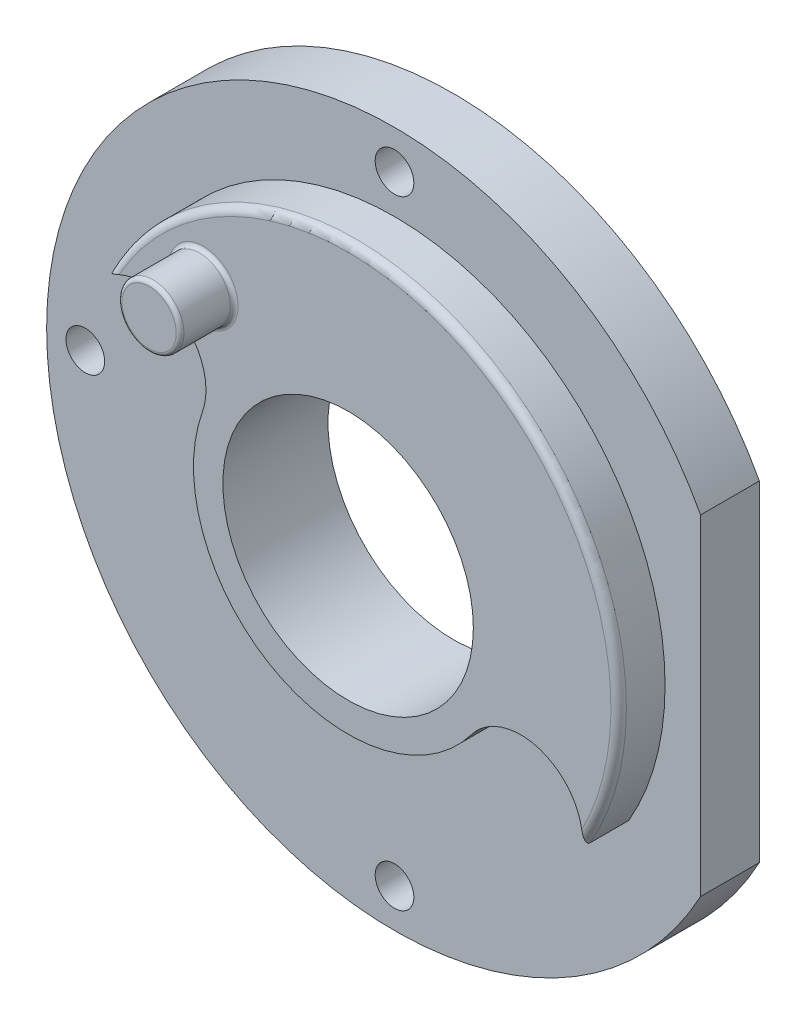
ISO-10303-21;
HEADER;
FILE_DESCRIPTION(('STEP AP214'),'2;1');
FILE_NAME('part.step','',(''),(''),'','','');
FILE_SCHEMA(('AUTOMOTIVE_DESIGN { 1 0 10303 214 1 1 1 1 }'));
ENDSEC;
DATA;
#1=APPLICATION_CONTEXT('core data for automotive mechanical design processes');
#2=APPLICATION_PROTOCOL_DEFINITION('international standard','automotive_design',2000,#1);
#3=PRODUCT_CONTEXT('',#1,'mechanical');
#4=PRODUCT('Part','Part','',(#3));
#5=PRODUCT_RELATED_PRODUCT_CATEGORY('part','',(#4));
#6=PRODUCT_DEFINITION_FORMATION('','',#4);
#7=PRODUCT_DEFINITION_CONTEXT('part definition',#1,'design');
#8=PRODUCT_DEFINITION('design','',#6,#7);
#9=PRODUCT_DEFINITION_SHAPE('','',#8);
#10=(LENGTH_UNIT() NAMED_UNIT(*) SI_UNIT(.MILLI.,.METRE.));
#11=(NAMED_UNIT(*) PLANE_ANGLE_UNIT() SI_UNIT($,.RADIAN.));
#12=(NAMED_UNIT(*) SI_UNIT($,.STERADIAN.) SOLID_ANGLE_UNIT());
#13=UNCERTAINTY_MEASURE_WITH_UNIT(LENGTH_MEASURE(1.E-05),#10,'distance_accuracy_value','');
#14=(GEOMETRIC_REPRESENTATION_CONTEXT(3) GLOBAL_UNCERTAINTY_ASSIGNED_CONTEXT((#13)) GLOBAL_UNIT_ASSIGNED_CONTEXT((#10,
#11,#12)) REPRESENTATION_CONTEXT('',''));
#15=CARTESIAN_POINT('',(0.,0.,0.));
#16=DIRECTION('',(0.,0.,1.));
#17=DIRECTION('',(1.,0.,0.));
#18=AXIS2_PLACEMENT_3D('',#15,#16,#17);
#19=CARTESIAN_POINT('',(0.,0.,3.8));
#20=DIRECTION('',(0.,0.,1.));
#21=DIRECTION('',(1.,0.,0.));
#22=AXIS2_PLACEMENT_3D('',#19,#20,#21);
#23=PLANE('',#22);
#24=DIRECTION('',(0.,-1.,0.));
#25=VECTOR('',#24,1.);
#26=CARTESIAN_POINT('',(19.8,-17.9414071691897,3.8));
#27=LINE('',#26,#25);
#28=CARTESIAN_POINT('',(19.8,10.6869078783341,3.8));
#29=VERTEX_POINT('',#28);
#30=CARTESIAN_POINT('',(19.8,-10.6869078783341,3.8));
#31=VERTEX_POINT('',#30);
#32=EDGE_CURVE('E61',#29,#31,#27,.T.);
#33=ORIENTED_EDGE('',*,*,#32,.F.);
#34=CARTESIAN_POINT('',(0.,0.,3.8));
#35=DIRECTION('',(0.,0.,1.));
#36=DIRECTION('',(1.,0.,0.));
#37=AXIS2_PLACEMENT_3D('',#34,#35,#36);
#38=CIRCLE('',#37,22.5);
#39=EDGE_CURVE('E112',#29,#31,#38,.T.);
#40=ORIENTED_EDGE('',*,*,#39,.T.);
#41=EDGE_LOOP('',(#33,#40));
#42=FACE_BOUND('',#41,.T.);
#43=CARTESIAN_POINT('',(0.,0.,3.8));
#44=DIRECTION('',(0.,0.,1.));
#45=DIRECTION('',(1.,0.,0.));
#46=AXIS2_PLACEMENT_3D('',#43,#44,#45);
#47=CIRCLE('',#46,17.5);
#48=CARTESIAN_POINT('',(15.1549923195811,-8.75078326742467,3.8));
#49=VERTEX_POINT('',#48);
#50=CARTESIAN_POINT('',(-15.6420504470762,7.84705408488593,3.8));
#51=VERTEX_POINT('',#50);
#52=EDGE_CURVE('E382',#49,#51,#47,.T.);
#53=ORIENTED_EDGE('',*,*,#52,.F.);
#54=CARTESIAN_POINT('',(11.1667639341912,-8.44413306610253,3.8));
#55=DIRECTION('',(0.,0.,1.));
#56=DIRECTION('',(1.,0.,0.));
#57=AXIS2_PLACEMENT_3D('',#54,#55,#56);
#58=CIRCLE('',#57,4.);
#59=CARTESIAN_POINT('',(7.97625995299374,-6.03152361864466,3.8));
#60=VERTEX_POINT('',#59);
#61=EDGE_CURVE('E416',#49,#60,#58,.T.);
#62=ORIENTED_EDGE('',*,*,#61,.T.);
#63=CARTESIAN_POINT('',(0.,0.,3.8));
#64=DIRECTION('',(0.,0.,-1.));
#65=DIRECTION('',(1.,0.,0.));
#66=AXIS2_PLACEMENT_3D('',#63,#64,#65);
#67=CIRCLE('',#66,10.);
#68=CARTESIAN_POINT('',(-9.42360161570558,3.34600247885013,3.8));
#69=VERTEX_POINT('',#68);
#70=EDGE_CURVE('E378',#60,#69,#67,.T.);
#71=ORIENTED_EDGE('',*,*,#70,.T.);
#72=CARTESIAN_POINT('',(-13.1930422619878,4.68440347039018,3.8));
#73=DIRECTION('',(0.,0.,1.));
#74=DIRECTION('',(1.,0.,0.));
#75=AXIS2_PLACEMENT_3D('',#72,#73,#74);
#76=CIRCLE('',#75,4.);
#77=EDGE_CURVE('E368',#69,#51,#76,.T.);
#78=ORIENTED_EDGE('',*,*,#77,.T.);
#79=EDGE_LOOP('',(#53,#62,#71,#78));
#80=FACE_BOUND('',#79,.T.);
#81=CARTESIAN_POINT('',(0.,-20.,3.8));
#82=DIRECTION('',(0.,0.,1.));
#83=DIRECTION('',(1.,0.,0.));
#84=AXIS2_PLACEMENT_3D('',#81,#82,#83);
#85=CIRCLE('',#84,1.25);
#86=CARTESIAN_POINT('',(-1.25,-20.,3.8));
#87=VERTEX_POINT('',#86);
#88=EDGE_CURVE('E392',#87,#87,#85,.T.);
#89=ORIENTED_EDGE('',*,*,#88,.F.);
#90=EDGE_LOOP('',(#89));
#91=FACE_BOUND('',#90,.T.);
#92=CARTESIAN_POINT('',(0.,20.,3.8));
#93=DIRECTION('',(0.,0.,1.));
#94=DIRECTION('',(1.,0.,0.));
#95=AXIS2_PLACEMENT_3D('',#92,#93,#94);
#96=CIRCLE('',#95,1.25);
#97=CARTESIAN_POINT('',(-1.25,20.,3.8));
#98=VERTEX_POINT('',#97);
#99=EDGE_CURVE('E121',#98,#98,#96,.T.);
#100=ORIENTED_EDGE('',*,*,#99,.F.);
#101=EDGE_LOOP('',(#100));
#102=FACE_BOUND('',#101,.T.);
#103=CARTESIAN_POINT('',(-20.,0.,3.8));
#104=DIRECTION('',(0.,0.,1.));
#105=DIRECTION('',(1.,0.,0.));
#106=AXIS2_PLACEMENT_3D('',#103,#104,#105);
#107=CIRCLE('',#106,1.25);
#108=CARTESIAN_POINT('',(-21.25,0.,3.8));
#109=VERTEX_POINT('',#108);
#110=EDGE_CURVE('E386',#109,#109,#107,.T.);
#111=ORIENTED_EDGE('',*,*,#110,.F.);
#112=EDGE_LOOP('',(#111));
#113=FACE_BOUND('',#112,.T.);
#114=ADVANCED_FACE('F46',(#42,#80,#91,#102,#113),#23,.T.);
#115=CARTESIAN_POINT('',(0.,0.,0.));
#116=DIRECTION('',(0.,0.,1.));
#117=DIRECTION('',(1.,0.,0.));
#118=AXIS2_PLACEMENT_3D('',#115,#116,#117);
#119=PLANE('',#118);
#120=CARTESIAN_POINT('',(0.,0.,0.));
#121=DIRECTION('',(0.,0.,1.));
#122=DIRECTION('',(1.,0.,0.));
#123=AXIS2_PLACEMENT_3D('',#120,#121,#122);
#124=CIRCLE('',#123,8.1);
#125=CARTESIAN_POINT('',(8.1,0.,0.));
#126=VERTEX_POINT('',#125);
#127=EDGE_CURVE('E370',#126,#126,#124,.T.);
#128=ORIENTED_EDGE('',*,*,#127,.T.);
#129=EDGE_LOOP('',(#128));
#130=FACE_BOUND('',#129,.T.);
#131=CARTESIAN_POINT('',(0.,0.,0.));
#132=DIRECTION('',(0.,0.,1.));
#133=DIRECTION('',(1.,0.,0.));
#134=AXIS2_PLACEMENT_3D('',#131,#132,#133);
#135=CIRCLE('',#134,22.5);
#136=CARTESIAN_POINT('',(19.8,10.6869078783341,0.));
#137=VERTEX_POINT('',#136);
#138=CARTESIAN_POINT('',(19.8,-10.6869078783341,0.));
#139=VERTEX_POINT('',#138);
#140=EDGE_CURVE('E116',#137,#139,#135,.T.);
#141=ORIENTED_EDGE('',*,*,#140,.F.);
#142=DIRECTION('',(0.,-1.,0.));
#143=VECTOR('',#142,1.);
#144=CARTESIAN_POINT('',(19.8,0.,0.));
#145=LINE('',#144,#143);
#146=EDGE_CURVE('E104',#137,#139,#145,.T.);
#147=ORIENTED_EDGE('',*,*,#146,.T.);
#148=EDGE_LOOP('',(#141,#147));
#149=FACE_BOUND('',#148,.T.);
#150=CARTESIAN_POINT('',(0.,20.,0.));
#151=DIRECTION('',(0.,0.,1.));
#152=DIRECTION('',(1.,0.,0.));
#153=AXIS2_PLACEMENT_3D('',#150,#151,#152);
#154=CIRCLE('',#153,1.25);
#155=CARTESIAN_POINT('',(-1.25,20.,0.));
#156=VERTEX_POINT('',#155);
#157=EDGE_CURVE('E124',#156,#156,#154,.T.);
#158=ORIENTED_EDGE('',*,*,#157,.T.);
#159=EDGE_LOOP('',(#158));
#160=FACE_BOUND('',#159,.T.);
#161=CARTESIAN_POINT('',(0.,-20.,0.));
#162=DIRECTION('',(0.,0.,1.));
#163=DIRECTION('',(1.,0.,0.));
#164=AXIS2_PLACEMENT_3D('',#161,#162,#163);
#165=CIRCLE('',#164,1.25);
#166=CARTESIAN_POINT('',(-1.25,-20.,0.));
#167=VERTEX_POINT('',#166);
#168=EDGE_CURVE('E389',#167,#167,#165,.T.);
#169=ORIENTED_EDGE('',*,*,#168,.T.);
#170=EDGE_LOOP('',(#169));
#171=FACE_BOUND('',#170,.T.);
#172=CARTESIAN_POINT('',(-20.,0.,0.));
#173=DIRECTION('',(0.,0.,1.));
#174=DIRECTION('',(1.,0.,0.));
#175=AXIS2_PLACEMENT_3D('',#172,#173,#174);
#176=CIRCLE('',#175,1.25);
#177=CARTESIAN_POINT('',(-21.25,0.,0.));
#178=VERTEX_POINT('',#177);
#179=EDGE_CURVE('E385',#178,#178,#176,.T.);
#180=ORIENTED_EDGE('',*,*,#179,.T.);
#181=EDGE_LOOP('',(#180));
#182=FACE_BOUND('',#181,.T.);
#183=ADVANCED_FACE('F199',(#130,#149,#160,#171,#182),#119,.F.);
#184=CARTESIAN_POINT('',(0.,0.,3.8));
#185=DIRECTION('',(0.,0.,-1.));
#186=DIRECTION('',(-1.,0.,0.));
#187=AXIS2_PLACEMENT_3D('',#184,#185,#186);
#188=CYLINDRICAL_SURFACE('',#187,22.5);
#189=ORIENTED_EDGE('',*,*,#39,.F.);
#190=DIRECTION('',(0.,0.,-1.));
#191=VECTOR('',#190,1.);
#192=CARTESIAN_POINT('',(19.8,10.6869078783341,3.8));
#193=LINE('',#192,#191);
#194=EDGE_CURVE('E11',#29,#137,#193,.T.);
#195=ORIENTED_EDGE('',*,*,#194,.T.);
#196=ORIENTED_EDGE('',*,*,#140,.T.);
#197=DIRECTION('',(0.,0.,-1.));
#198=VECTOR('',#197,1.);
#199=CARTESIAN_POINT('',(19.8,-10.6869078783341,3.8));
#200=LINE('',#199,#198);
#201=EDGE_CURVE('E54',#139,#31,#200,.F.);
#202=ORIENTED_EDGE('',*,*,#201,.T.);
#203=EDGE_LOOP('',(#189,#195,#196,#202));
#204=FACE_BOUND('',#203,.T.);
#205=ADVANCED_FACE('F114',(#204),#188,.T.);
#206=CARTESIAN_POINT('',(0.,20.,3.8));
#207=DIRECTION('',(0.,0.,-1.));
#208=DIRECTION('',(-1.,0.,0.));
#209=AXIS2_PLACEMENT_3D('',#206,#207,#208);
#210=CYLINDRICAL_SURFACE('',#209,1.25);
#211=CARTESIAN_POINT('',(-1.25,20.,3.8));
#212=CARTESIAN_POINT('',(-1.25,20.,3.76041666666667));
#213=CARTESIAN_POINT('',(-1.25,20.,3.72083333333333));
#214=CARTESIAN_POINT('',(-1.25,20.,3.64166666666667));
#215=CARTESIAN_POINT('',(-1.25,20.,3.60208333333333));
#216=CARTESIAN_POINT('',(-1.25,20.,3.52291666666667));
#217=CARTESIAN_POINT('',(-1.25,20.,3.48333333333333));
#218=CARTESIAN_POINT('',(-1.25,20.,3.40416666666667));
#219=CARTESIAN_POINT('',(-1.25,20.,3.36458333333333));
#220=CARTESIAN_POINT('',(-1.25,20.,3.28541666666667));
#221=CARTESIAN_POINT('',(-1.25,20.,3.24583333333333));
#222=CARTESIAN_POINT('',(-1.25,20.,3.16666666666667));
#223=CARTESIAN_POINT('',(-1.25,20.,3.12708333333333));
#224=CARTESIAN_POINT('',(-1.25,20.,3.04791666666667));
#225=CARTESIAN_POINT('',(-1.25,20.,3.00833333333333));
#226=CARTESIAN_POINT('',(-1.25,20.,2.92916666666667));
#227=CARTESIAN_POINT('',(-1.25,20.,2.88958333333333));
#228=CARTESIAN_POINT('',(-1.25,20.,2.81041666666667));
#229=CARTESIAN_POINT('',(-1.25,20.,2.77083333333333));
#230=CARTESIAN_POINT('',(-1.25,20.,2.69166666666667));
#231=CARTESIAN_POINT('',(-1.25,20.,2.65208333333333));
#232=CARTESIAN_POINT('',(-1.25,20.,2.57291666666667));
#233=CARTESIAN_POINT('',(-1.25,20.,2.53333333333333));
#234=CARTESIAN_POINT('',(-1.25,20.,2.45416666666667));
#235=CARTESIAN_POINT('',(-1.25,20.,2.41458333333333));
#236=CARTESIAN_POINT('',(-1.25,20.,2.33541666666667));
#237=CARTESIAN_POINT('',(-1.25,20.,2.29583333333333));
#238=CARTESIAN_POINT('',(-1.25,20.,2.21666666666667));
#239=CARTESIAN_POINT('',(-1.25,20.,2.17708333333333));
#240=CARTESIAN_POINT('',(-1.25,20.,2.09791666666667));
#241=CARTESIAN_POINT('',(-1.25,20.,2.05833333333333));
#242=CARTESIAN_POINT('',(-1.25,20.,1.97916666666667));
#243=CARTESIAN_POINT('',(-1.25,20.,1.93958333333333));
#244=CARTESIAN_POINT('',(-1.25,20.,1.86041666666667));
#245=CARTESIAN_POINT('',(-1.25,20.,1.82083333333333));
#246=CARTESIAN_POINT('',(-1.25,20.,1.74166666666667));
#247=CARTESIAN_POINT('',(-1.25,20.,1.70208333333333));
#248=CARTESIAN_POINT('',(-1.25,20.,1.62291666666667));
#249=CARTESIAN_POINT('',(-1.25,20.,1.58333333333333));
#250=CARTESIAN_POINT('',(-1.25,20.,1.50416666666667));
#251=CARTESIAN_POINT('',(-1.25,20.,1.46458333333333));
#252=CARTESIAN_POINT('',(-1.25,20.,1.38541666666667));
#253=CARTESIAN_POINT('',(-1.25,20.,1.34583333333333));
#254=CARTESIAN_POINT('',(-1.25,20.,1.26666666666667));
#255=CARTESIAN_POINT('',(-1.25,20.,1.22708333333333));
#256=CARTESIAN_POINT('',(-1.25,20.,1.14791666666667));
#257=CARTESIAN_POINT('',(-1.25,20.,1.10833333333333));
#258=CARTESIAN_POINT('',(-1.25,20.,1.02916666666667));
#259=CARTESIAN_POINT('',(-1.25,20.,0.989583333333334));
#260=CARTESIAN_POINT('',(-1.25,20.,0.910416666666667));
#261=CARTESIAN_POINT('',(-1.25,20.,0.870833333333333));
#262=CARTESIAN_POINT('',(-1.25,20.,0.791666666666667));
#263=CARTESIAN_POINT('',(-1.25,20.,0.752083333333333));
#264=CARTESIAN_POINT('',(-1.25,20.,0.672916666666667));
#265=CARTESIAN_POINT('',(-1.25,20.,0.633333333333333));
#266=CARTESIAN_POINT('',(-1.25,20.,0.554166666666667));
#267=CARTESIAN_POINT('',(-1.25,20.,0.514583333333334));
#268=CARTESIAN_POINT('',(-1.25,20.,0.435416666666667));
#269=CARTESIAN_POINT('',(-1.25,20.,0.395833333333334));
#270=CARTESIAN_POINT('',(-1.25,20.,0.316666666666667));
#271=CARTESIAN_POINT('',(-1.25,20.,0.277083333333333));
#272=CARTESIAN_POINT('',(-1.25,20.,0.197916666666667));
#273=CARTESIAN_POINT('',(-1.25,20.,0.158333333333333));
#274=CARTESIAN_POINT('',(-1.25,20.,0.0791666666666666));
#275=CARTESIAN_POINT('',(-1.25,20.,0.0395833333333333));
#276=CARTESIAN_POINT('',(-1.25,20.,0.));
#277=B_SPLINE_CURVE_WITH_KNOTS('',3,(#211,#212,#213,#214,#215,#216,#217,#218,#219,#220,#221,
#222,#223,#224,#225,#226,#227,#228,#229,#230,#231,#232,#233,#234,#235,#236,#237,#238,#239,#240,
#241,#242,#243,#244,#245,#246,#247,#248,#249,#250,#251,#252,#253,#254,#255,#256,#257,#258,#259,
#260,#261,#262,#263,#264,#265,#266,#267,#268,#269,#270,#271,#272,#273,#274,#275,#276),
.UNSPECIFIED.,.F.,.F.,(4,2,2,2,2,2,2,2,2,2,2,2,2,2,2,2,2,2,2,2,2,2,2,2,2,2,2,2,2,2,2,2,4),(0.,
0.11875,0.2375,0.35625,0.475,0.59375,0.7125,0.83125,0.95,1.06875,1.1875,1.30625,1.425,1.54375,
1.6625,1.78125,1.9,2.01875,2.1375,2.25625,2.375,2.49375,2.6125,2.73125,2.85,2.96875,3.0875,
3.20625,3.325,3.44375,3.5625,3.68125,3.8),.UNSPECIFIED.);
#278=EDGE_CURVE('BSEAM192',#98,#156,#277,.T.);
#279=ORIENTED_EDGE('',*,*,#99,.T.);
#280=ORIENTED_EDGE('',*,*,#157,.F.);
#281=ORIENTED_EDGE('',*,*,#278,.T.);
#282=ORIENTED_EDGE('',*,*,#278,.F.);
#283=EDGE_LOOP('',(#279,#281,#280,#282));
#284=FACE_BOUND('',#283,.T.);
#285=ADVANCED_FACE('F192',(#284),#210,.F.);
#286=CARTESIAN_POINT('',(0.,-20.,3.8));
#287=DIRECTION('',(0.,0.,-1.));
#288=DIRECTION('',(-1.,0.,0.));
#289=AXIS2_PLACEMENT_3D('',#286,#287,#288);
#290=CYLINDRICAL_SURFACE('',#289,1.25);
#291=CARTESIAN_POINT('',(-1.25,-20.,3.8));
#292=CARTESIAN_POINT('',(-1.25,-20.,3.76041666666667));
#293=CARTESIAN_POINT('',(-1.25,-20.,3.72083333333333));
#294=CARTESIAN_POINT('',(-1.25,-20.,3.64166666666667));
#295=CARTESIAN_POINT('',(-1.25,-20.,3.60208333333333));
#296=CARTESIAN_POINT('',(-1.25,-20.,3.52291666666667));
#297=CARTESIAN_POINT('',(-1.25,-20.,3.48333333333333));
#298=CARTESIAN_POINT('',(-1.25,-20.,3.40416666666667));
#299=CARTESIAN_POINT('',(-1.25,-20.,3.36458333333333));
#300=CARTESIAN_POINT('',(-1.25,-20.,3.28541666666667));
#301=CARTESIAN_POINT('',(-1.25,-20.,3.24583333333333));
#302=CARTESIAN_POINT('',(-1.25,-20.,3.16666666666667));
#303=CARTESIAN_POINT('',(-1.25,-20.,3.12708333333333));
#304=CARTESIAN_POINT('',(-1.25,-20.,3.04791666666667));
#305=CARTESIAN_POINT('',(-1.25,-20.,3.00833333333333));
#306=CARTESIAN_POINT('',(-1.25,-20.,2.92916666666667));
#307=CARTESIAN_POINT('',(-1.25,-20.,2.88958333333333));
#308=CARTESIAN_POINT('',(-1.25,-20.,2.81041666666667));
#309=CARTESIAN_POINT('',(-1.25,-20.,2.77083333333333));
#310=CARTESIAN_POINT('',(-1.25,-20.,2.69166666666667));
#311=CARTESIAN_POINT('',(-1.25,-20.,2.65208333333333));
#312=CARTESIAN_POINT('',(-1.25,-20.,2.57291666666667));
#313=CARTESIAN_POINT('',(-1.25,-20.,2.53333333333333));
#314=CARTESIAN_POINT('',(-1.25,-20.,2.45416666666667));
#315=CARTESIAN_POINT('',(-1.25,-20.,2.41458333333333));
#316=CARTESIAN_POINT('',(-1.25,-20.,2.33541666666667));
#317=CARTESIAN_POINT('',(-1.25,-20.,2.29583333333333));
#318=CARTESIAN_POINT('',(-1.25,-20.,2.21666666666667));
#319=CARTESIAN_POINT('',(-1.25,-20.,2.17708333333333));
#320=CARTESIAN_POINT('',(-1.25,-20.,2.09791666666667));
#321=CARTESIAN_POINT('',(-1.25,-20.,2.05833333333333));
#322=CARTESIAN_POINT('',(-1.25,-20.,1.97916666666667));
#323=CARTESIAN_POINT('',(-1.25,-20.,1.93958333333333));
#324=CARTESIAN_POINT('',(-1.25,-20.,1.86041666666667));
#325=CARTESIAN_POINT('',(-1.25,-20.,1.82083333333333));
#326=CARTESIAN_POINT('',(-1.25,-20.,1.74166666666667));
#327=CARTESIAN_POINT('',(-1.25,-20.,1.70208333333333));
#328=CARTESIAN_POINT('',(-1.25,-20.,1.62291666666667));
#329=CARTESIAN_POINT('',(-1.25,-20.,1.58333333333333));
#330=CARTESIAN_POINT('',(-1.25,-20.,1.50416666666667));
#331=CARTESIAN_POINT('',(-1.25,-20.,1.46458333333333));
#332=CARTESIAN_POINT('',(-1.25,-20.,1.38541666666667));
#333=CARTESIAN_POINT('',(-1.25,-20.,1.34583333333333));
#334=CARTESIAN_POINT('',(-1.25,-20.,1.26666666666667));
#335=CARTESIAN_POINT('',(-1.25,-20.,1.22708333333333));
#336=CARTESIAN_POINT('',(-1.25,-20.,1.14791666666667));
#337=CARTESIAN_POINT('',(-1.25,-20.,1.10833333333333));
#338=CARTESIAN_POINT('',(-1.25,-20.,1.02916666666667));
#339=CARTESIAN_POINT('',(-1.25,-20.,0.989583333333334));
#340=CARTESIAN_POINT('',(-1.25,-20.,0.910416666666667));
#341=CARTESIAN_POINT('',(-1.25,-20.,0.870833333333333));
#342=CARTESIAN_POINT('',(-1.25,-20.,0.791666666666667));
#343=CARTESIAN_POINT('',(-1.25,-20.,0.752083333333333));
#344=CARTESIAN_POINT('',(-1.25,-20.,0.672916666666667));
#345=CARTESIAN_POINT('',(-1.25,-20.,0.633333333333333));
#346=CARTESIAN_POINT('',(-1.25,-20.,0.554166666666667));
#347=CARTESIAN_POINT('',(-1.25,-20.,0.514583333333334));
#348=CARTESIAN_POINT('',(-1.25,-20.,0.435416666666667));
#349=CARTESIAN_POINT('',(-1.25,-20.,0.395833333333334));
#350=CARTESIAN_POINT('',(-1.25,-20.,0.316666666666667));
#351=CARTESIAN_POINT('',(-1.25,-20.,0.277083333333333));
#352=CARTESIAN_POINT('',(-1.25,-20.,0.197916666666667));
#353=CARTESIAN_POINT('',(-1.25,-20.,0.158333333333333));
#354=CARTESIAN_POINT('',(-1.25,-20.,0.0791666666666666));
#355=CARTESIAN_POINT('',(-1.25,-20.,0.0395833333333333));
#356=CARTESIAN_POINT('',(-1.25,-20.,0.));
#357=B_SPLINE_CURVE_WITH_KNOTS('',3,(#291,#292,#293,#294,#295,#296,#297,#298,#299,#300,#301,
#302,#303,#304,#305,#306,#307,#308,#309,#310,#311,#312,#313,#314,#315,#316,#317,#318,#319,#320,
#321,#322,#323,#324,#325,#326,#327,#328,#329,#330,#331,#332,#333,#334,#335,#336,#337,#338,#339,
#340,#341,#342,#343,#344,#345,#346,#347,#348,#349,#350,#351,#352,#353,#354,#355,#356),
.UNSPECIFIED.,.F.,.F.,(4,2,2,2,2,2,2,2,2,2,2,2,2,2,2,2,2,2,2,2,2,2,2,2,2,2,2,2,2,2,2,2,4),(0.,
0.11875,0.2375,0.35625,0.475,0.59375,0.7125,0.83125,0.95,1.06875,1.1875,1.30625,1.425,1.54375,
1.6625,1.78125,1.9,2.01875,2.1375,2.25625,2.375,2.49375,2.6125,2.73125,2.85,2.96875,3.0875,
3.20625,3.325,3.44375,3.5625,3.68125,3.8),.UNSPECIFIED.);
#358=EDGE_CURVE('BSEAM188',#87,#167,#357,.T.);
#359=ORIENTED_EDGE('',*,*,#88,.T.);
#360=ORIENTED_EDGE('',*,*,#168,.F.);
#361=ORIENTED_EDGE('',*,*,#358,.T.);
#362=ORIENTED_EDGE('',*,*,#358,.F.);
#363=EDGE_LOOP('',(#359,#361,#360,#362));
#364=FACE_BOUND('',#363,.T.);
#365=ADVANCED_FACE('F188',(#364),#290,.F.);
#366=CARTESIAN_POINT('',(-20.,0.,3.8));
#367=DIRECTION('',(0.,0.,-1.));
#368=DIRECTION('',(-1.,0.,0.));
#369=AXIS2_PLACEMENT_3D('',#366,#367,#368);
#370=CYLINDRICAL_SURFACE('',#369,1.25);
#371=CARTESIAN_POINT('',(-21.25,0.,3.8));
#372=CARTESIAN_POINT('',(-21.25,0.,3.76041666666667));
#373=CARTESIAN_POINT('',(-21.25,0.,3.72083333333333));
#374=CARTESIAN_POINT('',(-21.25,0.,3.64166666666667));
#375=CARTESIAN_POINT('',(-21.25,0.,3.60208333333333));
#376=CARTESIAN_POINT('',(-21.25,0.,3.52291666666667));
#377=CARTESIAN_POINT('',(-21.25,0.,3.48333333333333));
#378=CARTESIAN_POINT('',(-21.25,0.,3.40416666666667));
#379=CARTESIAN_POINT('',(-21.25,0.,3.36458333333333));
#380=CARTESIAN_POINT('',(-21.25,0.,3.28541666666667));
#381=CARTESIAN_POINT('',(-21.25,0.,3.24583333333333));
#382=CARTESIAN_POINT('',(-21.25,0.,3.16666666666667));
#383=CARTESIAN_POINT('',(-21.25,0.,3.12708333333333));
#384=CARTESIAN_POINT('',(-21.25,0.,3.04791666666667));
#385=CARTESIAN_POINT('',(-21.25,0.,3.00833333333333));
#386=CARTESIAN_POINT('',(-21.25,0.,2.92916666666667));
#387=CARTESIAN_POINT('',(-21.25,0.,2.88958333333333));
#388=CARTESIAN_POINT('',(-21.25,0.,2.81041666666667));
#389=CARTESIAN_POINT('',(-21.25,0.,2.77083333333333));
#390=CARTESIAN_POINT('',(-21.25,0.,2.69166666666667));
#391=CARTESIAN_POINT('',(-21.25,0.,2.65208333333333));
#392=CARTESIAN_POINT('',(-21.25,0.,2.57291666666667));
#393=CARTESIAN_POINT('',(-21.25,0.,2.53333333333333));
#394=CARTESIAN_POINT('',(-21.25,0.,2.45416666666667));
#395=CARTESIAN_POINT('',(-21.25,0.,2.41458333333333));
#396=CARTESIAN_POINT('',(-21.25,0.,2.33541666666667));
#397=CARTESIAN_POINT('',(-21.25,0.,2.29583333333333));
#398=CARTESIAN_POINT('',(-21.25,0.,2.21666666666667));
#399=CARTESIAN_POINT('',(-21.25,0.,2.17708333333333));
#400=CARTESIAN_POINT('',(-21.25,0.,2.09791666666667));
#401=CARTESIAN_POINT('',(-21.25,0.,2.05833333333333));
#402=CARTESIAN_POINT('',(-21.25,0.,1.97916666666667));
#403=CARTESIAN_POINT('',(-21.25,0.,1.93958333333333));
#404=CARTESIAN_POINT('',(-21.25,0.,1.86041666666667));
#405=CARTESIAN_POINT('',(-21.25,0.,1.82083333333333));
#406=CARTESIAN_POINT('',(-21.25,0.,1.74166666666667));
#407=CARTESIAN_POINT('',(-21.25,0.,1.70208333333333));
#408=CARTESIAN_POINT('',(-21.25,0.,1.62291666666667));
#409=CARTESIAN_POINT('',(-21.25,0.,1.58333333333333));
#410=CARTESIAN_POINT('',(-21.25,0.,1.50416666666667));
#411=CARTESIAN_POINT('',(-21.25,0.,1.46458333333333));
#412=CARTESIAN_POINT('',(-21.25,0.,1.38541666666667));
#413=CARTESIAN_POINT('',(-21.25,0.,1.34583333333333));
#414=CARTESIAN_POINT('',(-21.25,0.,1.26666666666667));
#415=CARTESIAN_POINT('',(-21.25,0.,1.22708333333333));
#416=CARTESIAN_POINT('',(-21.25,0.,1.14791666666667));
#417=CARTESIAN_POINT('',(-21.25,0.,1.10833333333333));
#418=CARTESIAN_POINT('',(-21.25,0.,1.02916666666667));
#419=CARTESIAN_POINT('',(-21.25,0.,0.989583333333334));
#420=CARTESIAN_POINT('',(-21.25,0.,0.910416666666667));
#421=CARTESIAN_POINT('',(-21.25,0.,0.870833333333333));
#422=CARTESIAN_POINT('',(-21.25,0.,0.791666666666667));
#423=CARTESIAN_POINT('',(-21.25,0.,0.752083333333333));
#424=CARTESIAN_POINT('',(-21.25,0.,0.672916666666667));
#425=CARTESIAN_POINT('',(-21.25,0.,0.633333333333333));
#426=CARTESIAN_POINT('',(-21.25,0.,0.554166666666667));
#427=CARTESIAN_POINT('',(-21.25,0.,0.514583333333334));
#428=CARTESIAN_POINT('',(-21.25,0.,0.435416666666667));
#429=CARTESIAN_POINT('',(-21.25,0.,0.395833333333334));
#430=CARTESIAN_POINT('',(-21.25,0.,0.316666666666667));
#431=CARTESIAN_POINT('',(-21.25,0.,0.277083333333333));
#432=CARTESIAN_POINT('',(-21.25,0.,0.197916666666667));
#433=CARTESIAN_POINT('',(-21.25,0.,0.158333333333333));
#434=CARTESIAN_POINT('',(-21.25,0.,0.0791666666666666));
#435=CARTESIAN_POINT('',(-21.25,0.,0.0395833333333333));
#436=CARTESIAN_POINT('',(-21.25,0.,0.));
#437=B_SPLINE_CURVE_WITH_KNOTS('',3,(#371,#372,#373,#374,#375,#376,#377,#378,#379,#380,#381,
#382,#383,#384,#385,#386,#387,#388,#389,#390,#391,#392,#393,#394,#395,#396,#397,#398,#399,#400,
#401,#402,#403,#404,#405,#406,#407,#408,#409,#410,#411,#412,#413,#414,#415,#416,#417,#418,#419,
#420,#421,#422,#423,#424,#425,#426,#427,#428,#429,#430,#431,#432,#433,#434,#435,#436),
.UNSPECIFIED.,.F.,.F.,(4,2,2,2,2,2,2,2,2,2,2,2,2,2,2,2,2,2,2,2,2,2,2,2,2,2,2,2,2,2,2,2,4),(0.,
0.11875,0.2375,0.35625,0.475,0.59375,0.7125,0.83125,0.95,1.06875,1.1875,1.30625,1.425,1.54375,
1.6625,1.78125,1.9,2.01875,2.1375,2.25625,2.375,2.49375,2.6125,2.73125,2.85,2.96875,3.0875,
3.20625,3.325,3.44375,3.5625,3.68125,3.8),.UNSPECIFIED.);
#438=EDGE_CURVE('BSEAM184',#109,#178,#437,.T.);
#439=ORIENTED_EDGE('',*,*,#110,.T.);
#440=ORIENTED_EDGE('',*,*,#179,.F.);
#441=ORIENTED_EDGE('',*,*,#438,.T.);
#442=ORIENTED_EDGE('',*,*,#438,.F.);
#443=EDGE_LOOP('',(#439,#441,#440,#442));
#444=FACE_BOUND('',#443,.T.);
#445=ADVANCED_FACE('F184',(#444),#370,.F.);
#446=CARTESIAN_POINT('',(0.,0.,6.8));
#447=DIRECTION('',(0.,0.,-1.));
#448=DIRECTION('',(-1.,0.,0.));
#449=AXIS2_PLACEMENT_3D('',#446,#447,#448);
#450=CYLINDRICAL_SURFACE('',#449,17.5);
#451=ORIENTED_EDGE('',*,*,#52,.T.);
#452=DIRECTION('',(0.,0.,1.));
#453=VECTOR('',#452,1.);
#454=CARTESIAN_POINT('',(-15.6420504470762,7.84705408488592,5.3));
#455=LINE('',#454,#453);
#456=CARTESIAN_POINT('',(-15.6420504470762,7.84705408488594,6.30000000000087));
#457=VERTEX_POINT('',#456);
#458=EDGE_CURVE('E380',#51,#457,#455,.T.);
#459=ORIENTED_EDGE('',*,*,#458,.T.);
#460=CARTESIAN_POINT('',(0.,0.,6.3));
#461=DIRECTION('',(0.,0.,1.));
#462=DIRECTION('',(1.,0.,0.));
#463=AXIS2_PLACEMENT_3D('',#460,#461,#462);
#464=CIRCLE('',#463,17.5);
#465=CARTESIAN_POINT('',(15.1549923195811,-8.75078326742466,6.3));
#466=VERTEX_POINT('',#465);
#467=EDGE_CURVE('E119',#457,#466,#464,.F.);
#468=ORIENTED_EDGE('',*,*,#467,.T.);
#469=DIRECTION('',(0.,0.,1.));
#470=VECTOR('',#469,1.);
#471=CARTESIAN_POINT('',(15.1549923195811,-8.75078326742468,5.3));
#472=LINE('',#471,#470);
#473=EDGE_CURVE('E69',#466,#49,#472,.F.);
#474=ORIENTED_EDGE('',*,*,#473,.T.);
#475=EDGE_LOOP('',(#451,#459,#468,#474));
#476=FACE_BOUND('',#475,.T.);
#477=ADVANCED_FACE('F180',(#476),#450,.T.);
#478=CARTESIAN_POINT('',(0.,0.,6.8));
#479=DIRECTION('',(0.,0.,1.));
#480=DIRECTION('',(1.,0.,0.));
#481=AXIS2_PLACEMENT_3D('',#478,#479,#480);
#482=PLANE('',#481);
#483=CARTESIAN_POINT('',(0.,0.,6.8));
#484=DIRECTION('',(0.,0.,1.));
#485=DIRECTION('',(1.,0.,0.));
#486=AXIS2_PLACEMENT_3D('',#483,#484,#485);
#487=CIRCLE('',#486,8.1);
#488=CARTESIAN_POINT('',(8.1,0.,6.8));
#489=VERTEX_POINT('',#488);
#490=EDGE_CURVE('E424',#489,#489,#487,.T.);
#491=ORIENTED_EDGE('',*,*,#490,.F.);
#492=EDGE_LOOP('',(#491));
#493=FACE_BOUND('',#492,.T.);
#494=CARTESIAN_POINT('',(-13.1930422619878,4.68440347039018,6.8));
#495=DIRECTION('',(0.,0.,1.));
#496=DIRECTION('',(1.,0.,0.));
#497=AXIS2_PLACEMENT_3D('',#494,#495,#496);
#498=CIRCLE('',#497,4.);
#499=CARTESIAN_POINT('',(-9.42360161570558,3.34600247885013,6.8));
#500=VERTEX_POINT('',#499);
#501=CARTESIAN_POINT('',(-14.8126068155352,8.34186306099305,6.8));
#502=VERTEX_POINT('',#501);
#503=EDGE_CURVE('E361',#500,#502,#498,.T.);
#504=ORIENTED_EDGE('',*,*,#503,.F.);
#505=CARTESIAN_POINT('',(0.,0.,6.8));
#506=DIRECTION('',(0.,0.,-1.));
#507=DIRECTION('',(1.,0.,0.));
#508=AXIS2_PLACEMENT_3D('',#505,#506,#507);
#509=CIRCLE('',#508,10.);
#510=CARTESIAN_POINT('',(7.97625995299374,-6.03152361864466,6.8));
#511=VERTEX_POINT('',#510);
#512=EDGE_CURVE('E364',#511,#500,#509,.T.);
#513=ORIENTED_EDGE('',*,*,#512,.F.);
#514=CARTESIAN_POINT('',(11.1667639341912,-8.44413306610253,6.8));
#515=DIRECTION('',(0.,0.,1.));
#516=DIRECTION('',(1.,0.,0.));
#517=AXIS2_PLACEMENT_3D('',#514,#515,#516);
#518=CIRCLE('',#517,4.);
#519=CARTESIAN_POINT('',(15.1122347108096,-7.78590791400737,6.8));
#520=VERTEX_POINT('',#519);
#521=EDGE_CURVE('E362',#520,#511,#518,.T.);
#522=ORIENTED_EDGE('',*,*,#521,.F.);
#523=CARTESIAN_POINT('',(0.,0.,6.8));
#524=DIRECTION('',(0.,0.,1.));
#525=DIRECTION('',(1.,0.,0.));
#526=AXIS2_PLACEMENT_3D('',#523,#524,#525);
#527=CIRCLE('',#526,17.);
#528=EDGE_CURVE('E115',#520,#502,#527,.T.);
#529=ORIENTED_EDGE('',*,*,#528,.T.);
#530=EDGE_LOOP('',(#504,#513,#522,#529));
#531=FACE_BOUND('',#530,.T.);
#532=CARTESIAN_POINT('',(-9.367828489024,10.4040275566835,6.8));
#533=DIRECTION('',(0.,0.,1.));
#534=DIRECTION('',(1.,0.,0.));
#535=AXIS2_PLACEMENT_3D('',#532,#533,#534);
#536=CIRCLE('',#535,2.25);
#537=CARTESIAN_POINT('',(-7.117828489024,10.4040275566835,6.8));
#538=VERTEX_POINT('',#537);
#539=EDGE_CURVE('E135',#538,#538,#536,.F.);
#540=ORIENTED_EDGE('',*,*,#539,.T.);
#541=EDGE_LOOP('',(#540));
#542=FACE_BOUND('',#541,.T.);
#543=ADVANCED_FACE('F176',(#493,#531,#542),#482,.T.);
#544=CARTESIAN_POINT('',(-9.367828489024,10.4040275566835,10.3));
#545=DIRECTION('',(0.,0.,-1.));
#546=DIRECTION('',(-1.,0.,0.));
#547=AXIS2_PLACEMENT_3D('',#544,#545,#546);
#548=CYLINDRICAL_SURFACE('',#547,2.);
#549=CARTESIAN_POINT('',(-9.367828489024,10.4040275566835,7.05));
#550=DIRECTION('',(0.,0.,1.));
#551=DIRECTION('',(1.,0.,0.));
#552=AXIS2_PLACEMENT_3D('',#549,#550,#551);
#553=CIRCLE('',#552,2.);
#554=CARTESIAN_POINT('',(-7.367828489024,10.4040275566835,7.05));
#555=VERTEX_POINT('',#554);
#556=EDGE_CURVE('E132',#555,#555,#553,.T.);
#557=ORIENTED_EDGE('',*,*,#556,.T.);
#558=EDGE_LOOP('',(#557));
#559=FACE_BOUND('',#558,.T.);
#560=CARTESIAN_POINT('',(-9.367828489024,10.4040275566835,10.05));
#561=DIRECTION('',(0.,0.,1.));
#562=DIRECTION('',(1.,0.,0.));
#563=AXIS2_PLACEMENT_3D('',#560,#561,#562);
#564=CIRCLE('',#563,2.);
#565=CARTESIAN_POINT('',(-7.367828489024,10.4040275566835,10.05));
#566=VERTEX_POINT('',#565);
#567=EDGE_CURVE('E129',#566,#566,#564,.F.);
#568=ORIENTED_EDGE('',*,*,#567,.T.);
#569=EDGE_LOOP('',(#568));
#570=FACE_BOUND('',#569,.T.);
#571=ADVANCED_FACE('F172',(#559,#570),#548,.T.);
#572=CARTESIAN_POINT('',(-9.367828489024,10.4040275566835,10.3));
#573=DIRECTION('',(0.,0.,1.));
#574=DIRECTION('',(1.,0.,0.));
#575=AXIS2_PLACEMENT_3D('',#572,#573,#574);
#576=PLANE('',#575);
#577=CARTESIAN_POINT('',(-9.367828489024,10.4040275566835,10.3));
#578=DIRECTION('',(0.,0.,1.));
#579=DIRECTION('',(1.,0.,0.));
#580=AXIS2_PLACEMENT_3D('',#577,#578,#579);
#581=CIRCLE('',#580,1.75);
#582=CARTESIAN_POINT('',(-7.617828489024,10.4040275566835,10.3));
#583=VERTEX_POINT('',#582);
#584=EDGE_CURVE('E138',#583,#583,#581,.T.);
#585=ORIENTED_EDGE('',*,*,#584,.T.);
#586=EDGE_LOOP('',(#585));
#587=FACE_BOUND('',#586,.T.);
#588=ADVANCED_FACE('F169',(#587),#576,.T.);
#589=CARTESIAN_POINT('',(0.,0.,6.3));
#590=DIRECTION('',(0.,0.,1.));
#591=DIRECTION('',(1.,0.,0.));
#592=AXIS2_PLACEMENT_3D('',#589,#590,#591);
#593=TOROIDAL_SURFACE('',#592,17.,0.5);
#594=CARTESIAN_POINT('',(-14.0925554842546,8.58195089960348,6.2998));
#595=CARTESIAN_POINT('',(-14.0924954054147,8.58195890672162,6.32210168366429));
#596=CARTESIAN_POINT('',(-14.0945603759896,8.58148831247698,6.34435811063712));
#597=CARTESIAN_POINT('',(-14.1025345979371,8.57963798600353,6.38796360897992));
#598=CARTESIAN_POINT('',(-14.1084143740486,8.57826522337488,6.40931831116789));
#599=CARTESIAN_POINT('',(-14.1236070048994,8.57466126596326,6.45062005844996));
#600=CARTESIAN_POINT('',(-14.1329125698104,8.57243189354615,6.47056998619173));
#601=CARTESIAN_POINT('',(-14.1544039544479,8.56717403516507,6.50876139570062));
#602=CARTESIAN_POINT('',(-14.1665951669323,8.56414405175444,6.52699958832805));
#603=CARTESIAN_POINT('',(-14.1980966929068,8.55612312486784,6.56776100602541));
#604=CARTESIAN_POINT('',(-14.2183897756552,8.55081893838281,6.58946250140604));
#605=CARTESIAN_POINT('',(-14.2619723270169,8.53899839198793,6.62920558857506));
#606=CARTESIAN_POINT('',(-14.2852671054368,8.53247987467245,6.64724054515997));
#607=CARTESIAN_POINT('',(-14.3438891877824,8.51543719811897,6.6865601989914));
#608=CARTESIAN_POINT('',(-14.3802149681455,8.50437010499717,6.70611473127519));
#609=CARTESIAN_POINT('',(-14.4549126003551,8.48035360309176,6.73910789174992));
#610=CARTESIAN_POINT('',(-14.4932873237058,8.46740150625873,6.75253767094439));
#611=CARTESIAN_POINT('',(-14.5894570539597,8.4332311650458,6.77929231348928));
#612=CARTESIAN_POINT('',(-14.6477652323556,8.41102145761363,6.7894972527948));
#613=CARTESIAN_POINT('',(-14.7640559652629,8.36352095122454,6.80053046521158));
#614=CARTESIAN_POINT('',(-14.8220369149504,8.3382206648887,6.80132909313015));
#615=CARTESIAN_POINT('',(-14.9536990871508,8.27700679749828,6.79394167019678));
#616=CARTESIAN_POINT('',(-15.0268241308473,8.24019780297733,6.78296472730493));
#617=CARTESIAN_POINT('',(-15.1328059834076,8.18282359179748,6.75732757505853));
#618=CARTESIAN_POINT('',(-15.1674755331101,8.16336383011166,6.74727110155497));
#619=CARTESIAN_POINT('',(-15.2354265017855,8.12390949394304,6.72403023438405));
#620=CARTESIAN_POINT('',(-15.2687089646543,8.10391534093849,6.71084824479495));
#621=CARTESIAN_POINT('',(-15.326023590079,8.06837302024599,6.68457855380953));
#622=CARTESIAN_POINT('',(-15.3504051067503,8.05287369551752,6.67218364463533));
#623=CARTESIAN_POINT('',(-15.3980402894818,8.02188639300569,6.64512556168753));
#624=CARTESIAN_POINT('',(-15.4212900507165,8.00639861422659,6.630455177971));
#625=CARTESIAN_POINT('',(-15.4719889025704,7.97188987430223,6.59441634174746));
#626=CARTESIAN_POINT('',(-15.4989855173005,7.95298159901716,6.57229502676871));
#627=CARTESIAN_POINT('',(-15.5490840398269,7.91704798570156,6.52268571596639));
#628=CARTESIAN_POINT('',(-15.5722105119845,7.90001102765007,6.49523416024955));
#629=CARTESIAN_POINT('',(-15.5991699213199,7.87981336033059,6.45223701264279));
#630=CARTESIAN_POINT('',(-15.6061467488276,7.87454292602374,6.43969129027768));
#631=CARTESIAN_POINT('',(-15.6185725441243,7.86510490048936,6.41353219350041));
#632=CARTESIAN_POINT('',(-15.6240285725322,7.86093221797937,6.3999241415989));
#633=CARTESIAN_POINT('',(-15.6328005738064,7.85420016935077,6.37226190552723));
#634=CARTESIAN_POINT('',(-15.636193768152,7.85158268482115,6.35824765464131));
#635=CARTESIAN_POINT('',(-15.6408615552638,7.84797496104798,6.32945366979672));
#636=CARTESIAN_POINT('',(-15.6421026110678,7.84701048339867,6.31466545516819));
#637=CARTESIAN_POINT('',(-15.6420503738977,7.84705414155187,6.2998));
#638=B_SPLINE_CURVE_WITH_KNOTS('',3,(#594,#595,#596,#597,#598,#599,#600,#601,#602,#603,#604,
#605,#606,#607,#608,#609,#610,#611,#612,#613,#614,#615,#616,#617,#618,#619,#620,#621,#622,#623,
#624,#625,#626,#627,#628,#629,#630,#631,#632,#633,#634,#635,#636,#637),.UNSPECIFIED.,.F.,.F.,(4,
2,2,2,2,2,2,2,2,2,2,2,2,2,2,2,2,2,2,2,2,4),(0.,0.0667299356915611,0.132950322840485,
0.199030604741618,0.265235367670184,0.355278870585106,0.445483899295612,0.572913410305842,
0.700526451736315,0.889151190584206,1.07837024591992,1.32482701157969,1.44775530274644,
1.57058934516832,1.6648208443637,1.75935726094649,1.87814165392614,1.99614088585409,
2.04190009722883,2.08744318260137,2.13115521090478,2.17554248395824),.UNSPECIFIED.);
#639=EDGE_CURVE('E149',#502,#457,#638,.T.);
#640=ORIENTED_EDGE('',*,*,#639,.F.);
#641=ORIENTED_EDGE('',*,*,#528,.F.);
#642=CARTESIAN_POINT('',(15.1549923266764,-8.75078317514375,6.2998));
#643=CARTESIAN_POINT('',(15.1549864480263,-8.75083501748741,6.31334183633755));
#644=CARTESIAN_POINT('',(15.1550879583852,-8.7495407208026,6.32683073056744));
#645=CARTESIAN_POINT('',(15.1554618273514,-8.74463073573373,6.35320351862826));
#646=CARTESIAN_POINT('',(15.1557319505222,-8.74104540690169,6.36609299381289));
#647=CARTESIAN_POINT('',(15.1564919222999,-8.73066793294204,6.39453419567725));
#648=CARTESIAN_POINT('',(15.157021505383,-8.72326958529509,6.40985918044714));
#649=CARTESIAN_POINT('',(15.1581844734355,-8.70611996400087,6.43919101848992));
#650=CARTESIAN_POINT('',(15.1588184345381,-8.6963554803261,6.45318983501797));
#651=CARTESIAN_POINT('',(15.1605366922394,-8.6679481599043,6.48896239042117));
#652=CARTESIAN_POINT('',(15.161633013222,-8.64779448939199,6.50952105259544));
#653=CARTESIAN_POINT('',(15.1635940988126,-8.60481107511497,6.54756507017572));
#654=CARTESIAN_POINT('',(15.1644583701314,-8.58197577649028,6.56504385172714));
#655=CARTESIAN_POINT('',(15.1658045729666,-8.5348252383894,6.59737350300039));
#656=CARTESIAN_POINT('',(15.1662898648533,-8.51052511299203,6.61224654076679));
#657=CARTESIAN_POINT('',(15.1668070632969,-8.46077634401863,6.63995320176573));
#658=CARTESIAN_POINT('',(15.1668385560817,-8.43532667349487,6.6527849532232));
#659=CARTESIAN_POINT('',(15.1661632557306,-8.3576584864415,6.6886664971283));
#660=CARTESIAN_POINT('',(15.164684043812,-8.30420056694496,6.70905155580027));
#661=CARTESIAN_POINT('',(15.160139222337,-8.21067496654829,6.7388633549337));
#662=CARTESIAN_POINT('',(15.1576305305356,-8.17102697114561,6.74976081387606));
#663=CARTESIAN_POINT('',(15.1513558155265,-8.0910905566369,6.76845017338404));
#664=CARTESIAN_POINT('',(15.1475891498228,-8.05080182031427,6.77624048253755));
#665=CARTESIAN_POINT('',(15.1343496604379,-7.92951732979093,6.79486605932403));
#666=CARTESIAN_POINT('',(15.1229284521873,-7.8479082438017,6.80101741986314));
#667=CARTESIAN_POINT('',(15.0996364101552,-7.7122803603174,6.79909026997404));
#668=CARTESIAN_POINT('',(15.0891280731723,-7.65794709267789,6.79499969576753));
#669=CARTESIAN_POINT('',(15.0661257503245,-7.5508538916176,6.77900340789334));
#670=CARTESIAN_POINT('',(15.0536355338713,-7.49809119287025,6.76711239825001));
#671=CARTESIAN_POINT('',(15.0313231773708,-7.41139621161847,6.73896995283988));
#672=CARTESIAN_POINT('',(15.0218375762686,-7.37659771766759,6.7251272999208));
#673=CARTESIAN_POINT('',(15.0026502185918,-7.30959315835768,6.69222006439132));
#674=CARTESIAN_POINT('',(14.9929487630466,-7.27738374016586,6.67316238088954));
#675=CARTESIAN_POINT('',(14.9764913968171,-7.22490073716813,6.6349925563384));
#676=CARTESIAN_POINT('',(14.9696283033717,-7.20370772307823,6.6171963080476));
#677=CARTESIAN_POINT('',(14.9565594201267,-7.16433692457174,6.57830775584842));
#678=CARTESIAN_POINT('',(14.9503528194063,-7.1461554041637,6.55721959989337));
#679=CARTESIAN_POINT('',(14.9401951578673,-7.11695221224745,6.51628628714516));
#680=CARTESIAN_POINT('',(14.9360401800262,-7.10522576817385,6.4969966201085));
#681=CARTESIAN_POINT('',(14.928781137479,-7.08496345924184,6.45664471240285));
#682=CARTESIAN_POINT('',(14.9256750046707,-7.07642131211724,6.43558606345819));
#683=CARTESIAN_POINT('',(14.9211613060392,-7.0640827145273,6.39554990083011));
#684=CARTESIAN_POINT('',(14.9195647877745,-7.05975505242317,6.37675756169118));
#685=CARTESIAN_POINT('',(14.9174049166409,-7.05391912037763,6.33858743166659));
#686=CARTESIAN_POINT('',(14.916846868013,-7.05242532435935,6.31920714617837));
#687=CARTESIAN_POINT('',(14.9168633402617,-7.05245981257292,6.2998));
#688=B_SPLINE_CURVE_WITH_KNOTS('',3,(#642,#643,#644,#645,#646,#647,#648,#649,#650,#651,#652,
#653,#654,#655,#656,#657,#658,#659,#660,#661,#662,#663,#664,#665,#666,#667,#668,#669,#670,#671,
#672,#673,#674,#675,#676,#677,#678,#679,#680,#681,#682,#683,#684,#685,#686,#687),.UNSPECIFIED.,
.F.,.F.,(4,2,2,2,2,2,2,2,2,2,2,2,2,2,2,2,2,2,2,2,2,2,4),(0.,0.040475002383402,
0.0804244703897522,0.131214975111177,0.18229585268172,0.268242696443802,0.354370824078783,
0.439726306714339,0.525159611181466,0.696307674425131,0.819764376615228,0.943284229597158,
1.18971664707348,1.35574600481352,1.52146328875512,1.63702740089944,1.75243936307799,
1.83768901219982,1.92283209729036,1.99142117950139,2.05987421772565,2.11768912813049,
2.1757985404537),.UNSPECIFIED.);
#689=EDGE_CURVE('E141',#466,#520,#688,.T.);
#690=ORIENTED_EDGE('',*,*,#689,.F.);
#691=ORIENTED_EDGE('',*,*,#467,.F.);
#692=EDGE_LOOP('',(#640,#641,#690,#691));
#693=FACE_BOUND('',#692,.T.);
#694=ADVANCED_FACE('F155',(#693),#593,.T.);
#695=CARTESIAN_POINT('',(-9.367828489024,10.4040275566835,7.05));
#696=DIRECTION('',(0.,0.,1.));
#697=DIRECTION('',(1.,0.,0.));
#698=AXIS2_PLACEMENT_3D('',#695,#696,#697);
#699=TOROIDAL_SURFACE('',#698,2.25,0.25);
#700=ORIENTED_EDGE('',*,*,#539,.F.);
#701=EDGE_LOOP('',(#700));
#702=FACE_BOUND('',#701,.T.);
#703=ORIENTED_EDGE('',*,*,#556,.F.);
#704=EDGE_LOOP('',(#703));
#705=FACE_BOUND('',#704,.T.);
#706=ADVANCED_FACE('F263',(#702,#705),#699,.F.);
#707=CARTESIAN_POINT('',(-9.367828489024,10.4040275566835,10.05));
#708=DIRECTION('',(0.,0.,1.));
#709=DIRECTION('',(1.,0.,0.));
#710=AXIS2_PLACEMENT_3D('',#707,#708,#709);
#711=TOROIDAL_SURFACE('',#710,1.75,0.25);
#712=ORIENTED_EDGE('',*,*,#567,.F.);
#713=EDGE_LOOP('',(#712));
#714=FACE_BOUND('',#713,.T.);
#715=ORIENTED_EDGE('',*,*,#584,.F.);
#716=EDGE_LOOP('',(#715));
#717=FACE_BOUND('',#716,.T.);
#718=ADVANCED_FACE('F48',(#714,#717),#711,.T.);
#719=CARTESIAN_POINT('',(-13.1930422619878,4.68440347039018,3.8));
#720=DIRECTION('',(0.,0.,1.));
#721=DIRECTION('',(1.,0.,0.));
#722=AXIS2_PLACEMENT_3D('',#719,#720,#721);
#723=CYLINDRICAL_SURFACE('',#722,4.);
#724=ORIENTED_EDGE('',*,*,#77,.F.);
#725=DIRECTION('',(0.,0.,1.));
#726=VECTOR('',#725,1.);
#727=CARTESIAN_POINT('',(-9.42360161570558,3.34600247885013,3.8));
#728=LINE('',#727,#726);
#729=EDGE_CURVE('E374',#69,#500,#728,.T.);
#730=ORIENTED_EDGE('',*,*,#729,.T.);
#731=ORIENTED_EDGE('',*,*,#503,.T.);
#732=ORIENTED_EDGE('',*,*,#639,.T.);
#733=ORIENTED_EDGE('',*,*,#458,.F.);
#734=EDGE_LOOP('',(#724,#730,#731,#732,#733));
#735=FACE_BOUND('',#734,.T.);
#736=ADVANCED_FACE('F163',(#735),#723,.F.);
#737=CARTESIAN_POINT('',(11.1667639341912,-8.44413306610253,3.8));
#738=DIRECTION('',(0.,0.,1.));
#739=DIRECTION('',(1.,0.,0.));
#740=AXIS2_PLACEMENT_3D('',#737,#738,#739);
#741=CYLINDRICAL_SURFACE('',#740,4.);
#742=ORIENTED_EDGE('',*,*,#689,.T.);
#743=ORIENTED_EDGE('',*,*,#521,.T.);
#744=DIRECTION('',(0.,0.,1.));
#745=VECTOR('',#744,1.);
#746=CARTESIAN_POINT('',(7.97625995299374,-6.03152361864466,3.8));
#747=LINE('',#746,#745);
#748=EDGE_CURVE('E376',#60,#511,#747,.T.);
#749=ORIENTED_EDGE('',*,*,#748,.F.);
#750=ORIENTED_EDGE('',*,*,#61,.F.);
#751=ORIENTED_EDGE('',*,*,#473,.F.);
#752=EDGE_LOOP('',(#742,#743,#749,#750,#751));
#753=FACE_BOUND('',#752,.T.);
#754=ADVANCED_FACE('F158',(#753),#741,.F.);
#755=CARTESIAN_POINT('',(0.,0.,3.8));
#756=DIRECTION('',(0.,0.,1.));
#757=DIRECTION('',(1.,0.,0.));
#758=AXIS2_PLACEMENT_3D('',#755,#756,#757);
#759=CYLINDRICAL_SURFACE('',#758,10.);
#760=ORIENTED_EDGE('',*,*,#512,.T.);
#761=ORIENTED_EDGE('',*,*,#729,.F.);
#762=ORIENTED_EDGE('',*,*,#70,.F.);
#763=ORIENTED_EDGE('',*,*,#748,.T.);
#764=EDGE_LOOP('',(#760,#761,#762,#763));
#765=FACE_BOUND('',#764,.T.);
#766=ADVANCED_FACE('F162',(#765),#759,.T.);
#767=CARTESIAN_POINT('',(0.,0.,-4.2));
#768=DIRECTION('',(0.,0.,1.));
#769=DIRECTION('',(1.,0.,0.));
#770=AXIS2_PLACEMENT_3D('',#767,#768,#769);
#771=CYLINDRICAL_SURFACE('',#770,8.1);
#772=ORIENTED_EDGE('',*,*,#490,.T.);
#773=EDGE_LOOP('',(#772));
#774=FACE_BOUND('',#773,.T.);
#775=ORIENTED_EDGE('',*,*,#127,.F.);
#776=EDGE_LOOP('',(#775));
#777=FACE_BOUND('',#776,.T.);
#778=ADVANCED_FACE('F214',(#774,#777),#771,.F.);
#779=CARTESIAN_POINT('',(19.8,-17.9414071691897,-13.2));
#780=DIRECTION('',(-1.,0.,0.));
#781=DIRECTION('',(0.,0.,1.));
#782=AXIS2_PLACEMENT_3D('',#779,#780,#781);
#783=PLANE('',#782);
#784=ORIENTED_EDGE('',*,*,#32,.T.);
#785=ORIENTED_EDGE('',*,*,#201,.F.);
#786=ORIENTED_EDGE('',*,*,#146,.F.);
#787=ORIENTED_EDGE('',*,*,#194,.F.);
#788=EDGE_LOOP('',(#784,#785,#786,#787));
#789=FACE_BOUND('',#788,.T.);
#790=ADVANCED_FACE('F102',(#789),#783,.F.);
#791=CLOSED_SHELL('',(#114,#183,#205,#285,#365,#445,#477,#543,#571,#588,#694,#706,#718,#736,
#754,#766,#778,#790));
#792=MANIFOLD_SOLID_BREP('B2',#791);
#793=ADVANCED_BREP_SHAPE_REPRESENTATION('',(#18,#792),#14);
#794=SHAPE_DEFINITION_REPRESENTATION(#9,#793);
ENDSEC;
END-ISO-10303-21;
